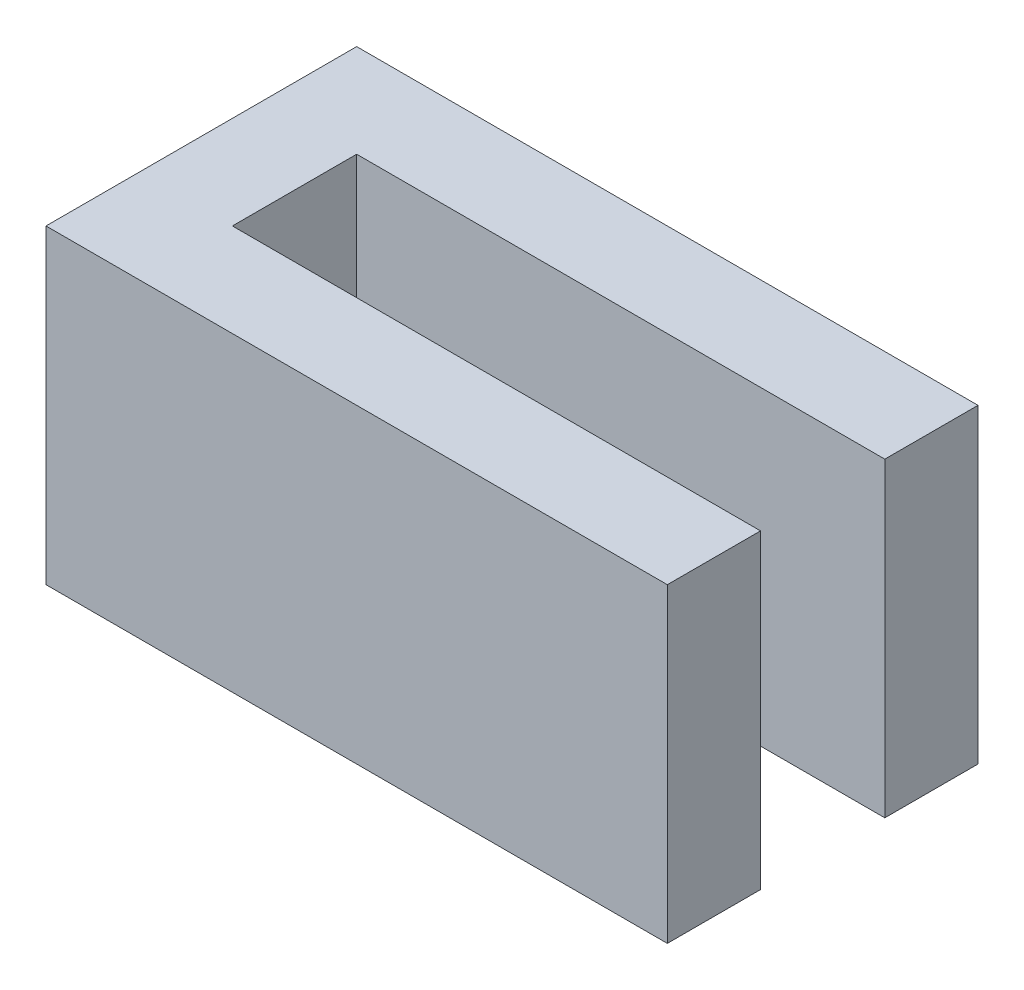
ISO-10303-21;
HEADER;
FILE_DESCRIPTION(('STEP AP214'),'2;1');
FILE_NAME('part.step','',(''),(''),'','','');
FILE_SCHEMA(('AUTOMOTIVE_DESIGN { 1 0 10303 214 1 1 1 1 }'));
ENDSEC;
DATA;
#1=APPLICATION_CONTEXT('core data for automotive mechanical design processes');
#2=APPLICATION_PROTOCOL_DEFINITION('international standard','automotive_design',2000,#1);
#3=PRODUCT_CONTEXT('',#1,'mechanical');
#4=PRODUCT('Part','Part','',(#3));
#5=PRODUCT_RELATED_PRODUCT_CATEGORY('part','',(#4));
#6=PRODUCT_DEFINITION_FORMATION('','',#4);
#7=PRODUCT_DEFINITION_CONTEXT('part definition',#1,'design');
#8=PRODUCT_DEFINITION('design','',#6,#7);
#9=PRODUCT_DEFINITION_SHAPE('','',#8);
#10=(LENGTH_UNIT() NAMED_UNIT(*) SI_UNIT(.MILLI.,.METRE.));
#11=(NAMED_UNIT(*) PLANE_ANGLE_UNIT() SI_UNIT($,.RADIAN.));
#12=(NAMED_UNIT(*) SI_UNIT($,.STERADIAN.) SOLID_ANGLE_UNIT());
#13=UNCERTAINTY_MEASURE_WITH_UNIT(LENGTH_MEASURE(1.E-05),#10,'distance_accuracy_value','');
#14=(GEOMETRIC_REPRESENTATION_CONTEXT(3) GLOBAL_UNCERTAINTY_ASSIGNED_CONTEXT((#13)) GLOBAL_UNIT_ASSIGNED_CONTEXT((#10,
#11,#12)) REPRESENTATION_CONTEXT('',''));
#15=CARTESIAN_POINT('',(0.,0.,0.));
#16=DIRECTION('',(0.,0.,1.));
#17=DIRECTION('',(1.,0.,0.));
#18=AXIS2_PLACEMENT_3D('',#15,#16,#17);
#19=CARTESIAN_POINT('',(0.,50.,-50.));
#20=DIRECTION('',(1.,0.,0.));
#21=DIRECTION('',(0.,0.,-1.));
#22=AXIS2_PLACEMENT_3D('',#19,#20,#21);
#23=PLANE('',#22);
#24=DIRECTION('',(0.,0.,1.));
#25=VECTOR('',#24,1.);
#26=CARTESIAN_POINT('',(0.,0.,-50.));
#27=LINE('',#26,#25);
#28=CARTESIAN_POINT('',(0.,0.,-50.));
#29=VERTEX_POINT('',#28);
#30=CARTESIAN_POINT('',(0.,0.,0.));
#31=VERTEX_POINT('',#30);
#32=EDGE_CURVE('E131',#29,#31,#27,.T.);
#33=ORIENTED_EDGE('',*,*,#32,.T.);
#34=DIRECTION('',(0.,-1.,0.));
#35=VECTOR('',#34,1.);
#36=CARTESIAN_POINT('',(0.,50.,0.));
#37=LINE('',#36,#35);
#38=CARTESIAN_POINT('',(0.,50.,0.));
#39=VERTEX_POINT('',#38);
#40=EDGE_CURVE('E11',#39,#31,#37,.T.);
#41=ORIENTED_EDGE('',*,*,#40,.F.);
#42=DIRECTION('',(0.,0.,1.));
#43=VECTOR('',#42,1.);
#44=CARTESIAN_POINT('',(0.,50.,-50.));
#45=LINE('',#44,#43);
#46=CARTESIAN_POINT('',(0.,50.,-50.));
#47=VERTEX_POINT('',#46);
#48=EDGE_CURVE('E145',#47,#39,#45,.T.);
#49=ORIENTED_EDGE('',*,*,#48,.F.);
#50=DIRECTION('',(0.,-1.,0.));
#51=VECTOR('',#50,1.);
#52=CARTESIAN_POINT('',(0.,50.,-50.));
#53=LINE('',#52,#51);
#54=EDGE_CURVE('E127',#47,#29,#53,.T.);
#55=ORIENTED_EDGE('',*,*,#54,.T.);
#56=EDGE_LOOP('',(#33,#41,#49,#55));
#57=FACE_BOUND('',#56,.T.);
#58=ADVANCED_FACE('F35',(#57),#23,.F.);
#59=CARTESIAN_POINT('',(0.,50.,0.));
#60=DIRECTION('',(0.,0.,-1.));
#61=DIRECTION('',(-1.,0.,0.));
#62=AXIS2_PLACEMENT_3D('',#59,#60,#61);
#63=PLANE('',#62);
#64=DIRECTION('',(1.,0.,0.));
#65=VECTOR('',#64,1.);
#66=CARTESIAN_POINT('',(0.,0.,0.));
#67=LINE('',#66,#65);
#68=CARTESIAN_POINT('',(100.,0.,0.));
#69=VERTEX_POINT('',#68);
#70=EDGE_CURVE('E134',#31,#69,#67,.T.);
#71=ORIENTED_EDGE('',*,*,#70,.T.);
#72=DIRECTION('',(0.,-1.,0.));
#73=VECTOR('',#72,1.);
#74=CARTESIAN_POINT('',(100.,50.,0.));
#75=LINE('',#74,#73);
#76=CARTESIAN_POINT('',(100.,50.,0.));
#77=VERTEX_POINT('',#76);
#78=EDGE_CURVE('E43',#77,#69,#75,.T.);
#79=ORIENTED_EDGE('',*,*,#78,.F.);
#80=DIRECTION('',(1.,0.,0.));
#81=VECTOR('',#80,1.);
#82=CARTESIAN_POINT('',(0.,50.,0.));
#83=LINE('',#82,#81);
#84=EDGE_CURVE('E94',#39,#77,#83,.T.);
#85=ORIENTED_EDGE('',*,*,#84,.F.);
#86=ORIENTED_EDGE('',*,*,#40,.T.);
#87=EDGE_LOOP('',(#71,#79,#85,#86));
#88=FACE_BOUND('',#87,.T.);
#89=ADVANCED_FACE('F180',(#88),#63,.F.);
#90=CARTESIAN_POINT('',(100.,50.,0.));
#91=DIRECTION('',(-1.,0.,0.));
#92=DIRECTION('',(0.,0.,1.));
#93=AXIS2_PLACEMENT_3D('',#90,#91,#92);
#94=PLANE('',#93);
#95=DIRECTION('',(0.,0.,-1.));
#96=VECTOR('',#95,1.);
#97=CARTESIAN_POINT('',(100.,0.,0.));
#98=LINE('',#97,#96);
#99=CARTESIAN_POINT('',(100.,0.,-15.));
#100=VERTEX_POINT('',#99);
#101=EDGE_CURVE('E136',#69,#100,#98,.T.);
#102=ORIENTED_EDGE('',*,*,#101,.T.);
#103=DIRECTION('',(0.,-1.,0.));
#104=VECTOR('',#103,1.);
#105=CARTESIAN_POINT('',(100.,50.,-15.));
#106=LINE('',#105,#104);
#107=CARTESIAN_POINT('',(100.,50.,-15.));
#108=VERTEX_POINT('',#107);
#109=EDGE_CURVE('E152',#108,#100,#106,.T.);
#110=ORIENTED_EDGE('',*,*,#109,.F.);
#111=DIRECTION('',(0.,0.,-1.));
#112=VECTOR('',#111,1.);
#113=CARTESIAN_POINT('',(100.,50.,0.));
#114=LINE('',#113,#112);
#115=EDGE_CURVE('E160',#77,#108,#114,.T.);
#116=ORIENTED_EDGE('',*,*,#115,.F.);
#117=ORIENTED_EDGE('',*,*,#78,.T.);
#118=EDGE_LOOP('',(#102,#110,#116,#117));
#119=FACE_BOUND('',#118,.T.);
#120=ADVANCED_FACE('F158',(#119),#94,.F.);
#121=CARTESIAN_POINT('',(100.,50.,-15.));
#122=DIRECTION('',(0.,0.,1.));
#123=DIRECTION('',(1.,0.,0.));
#124=AXIS2_PLACEMENT_3D('',#121,#122,#123);
#125=PLANE('',#124);
#126=DIRECTION('',(-1.,0.,0.));
#127=VECTOR('',#126,1.);
#128=CARTESIAN_POINT('',(100.,0.,-15.));
#129=LINE('',#128,#127);
#130=CARTESIAN_POINT('',(15.,0.,-15.));
#131=VERTEX_POINT('',#130);
#132=EDGE_CURVE('E138',#100,#131,#129,.T.);
#133=ORIENTED_EDGE('',*,*,#132,.T.);
#134=DIRECTION('',(0.,-1.,0.));
#135=VECTOR('',#134,1.);
#136=CARTESIAN_POINT('',(15.,50.,-15.));
#137=LINE('',#136,#135);
#138=CARTESIAN_POINT('',(15.,50.,-15.));
#139=VERTEX_POINT('',#138);
#140=EDGE_CURVE('E149',#139,#131,#137,.T.);
#141=ORIENTED_EDGE('',*,*,#140,.F.);
#142=DIRECTION('',(-1.,0.,0.));
#143=VECTOR('',#142,1.);
#144=CARTESIAN_POINT('',(100.,50.,-15.));
#145=LINE('',#144,#143);
#146=EDGE_CURVE('E172',#108,#139,#145,.T.);
#147=ORIENTED_EDGE('',*,*,#146,.F.);
#148=ORIENTED_EDGE('',*,*,#109,.T.);
#149=EDGE_LOOP('',(#133,#141,#147,#148));
#150=FACE_BOUND('',#149,.T.);
#151=ADVANCED_FACE('F168',(#150),#125,.F.);
#152=CARTESIAN_POINT('',(15.,50.,-15.));
#153=DIRECTION('',(-1.,0.,0.));
#154=DIRECTION('',(0.,0.,1.));
#155=AXIS2_PLACEMENT_3D('',#152,#153,#154);
#156=PLANE('',#155);
#157=DIRECTION('',(0.,0.,-1.));
#158=VECTOR('',#157,1.);
#159=CARTESIAN_POINT('',(15.,0.,-15.));
#160=LINE('',#159,#158);
#161=CARTESIAN_POINT('',(15.,0.,-35.));
#162=VERTEX_POINT('',#161);
#163=EDGE_CURVE('E140',#131,#162,#160,.T.);
#164=ORIENTED_EDGE('',*,*,#163,.T.);
#165=DIRECTION('',(0.,-1.,0.));
#166=VECTOR('',#165,1.);
#167=CARTESIAN_POINT('',(15.,50.,-35.));
#168=LINE('',#167,#166);
#169=CARTESIAN_POINT('',(15.,50.,-35.));
#170=VERTEX_POINT('',#169);
#171=EDGE_CURVE('E122',#170,#162,#168,.T.);
#172=ORIENTED_EDGE('',*,*,#171,.F.);
#173=DIRECTION('',(0.,0.,-1.));
#174=VECTOR('',#173,1.);
#175=CARTESIAN_POINT('',(15.,50.,-15.));
#176=LINE('',#175,#174);
#177=EDGE_CURVE('E113',#139,#170,#176,.T.);
#178=ORIENTED_EDGE('',*,*,#177,.F.);
#179=ORIENTED_EDGE('',*,*,#140,.T.);
#180=EDGE_LOOP('',(#164,#172,#178,#179));
#181=FACE_BOUND('',#180,.T.);
#182=ADVANCED_FACE('F171',(#181),#156,.F.);
#183=CARTESIAN_POINT('',(15.,50.,-35.));
#184=DIRECTION('',(0.,0.,-1.));
#185=DIRECTION('',(-1.,0.,0.));
#186=AXIS2_PLACEMENT_3D('',#183,#184,#185);
#187=PLANE('',#186);
#188=DIRECTION('',(1.,0.,0.));
#189=VECTOR('',#188,1.);
#190=CARTESIAN_POINT('',(15.,0.,-35.));
#191=LINE('',#190,#189);
#192=CARTESIAN_POINT('',(100.,0.,-35.));
#193=VERTEX_POINT('',#192);
#194=EDGE_CURVE('E121',#162,#193,#191,.T.);
#195=ORIENTED_EDGE('',*,*,#194,.T.);
#196=DIRECTION('',(0.,-1.,0.));
#197=VECTOR('',#196,1.);
#198=CARTESIAN_POINT('',(100.,50.,-35.));
#199=LINE('',#198,#197);
#200=CARTESIAN_POINT('',(100.,50.,-35.));
#201=VERTEX_POINT('',#200);
#202=EDGE_CURVE('E118',#201,#193,#199,.T.);
#203=ORIENTED_EDGE('',*,*,#202,.F.);
#204=DIRECTION('',(1.,0.,0.));
#205=VECTOR('',#204,1.);
#206=CARTESIAN_POINT('',(15.,50.,-35.));
#207=LINE('',#206,#205);
#208=EDGE_CURVE('E107',#170,#201,#207,.T.);
#209=ORIENTED_EDGE('',*,*,#208,.F.);
#210=ORIENTED_EDGE('',*,*,#171,.T.);
#211=EDGE_LOOP('',(#195,#203,#209,#210));
#212=FACE_BOUND('',#211,.T.);
#213=ADVANCED_FACE('F119',(#212),#187,.F.);
#214=CARTESIAN_POINT('',(100.,50.,-35.));
#215=DIRECTION('',(-1.,0.,0.));
#216=DIRECTION('',(0.,0.,1.));
#217=AXIS2_PLACEMENT_3D('',#214,#215,#216);
#218=PLANE('',#217);
#219=DIRECTION('',(0.,0.,-1.));
#220=VECTOR('',#219,1.);
#221=CARTESIAN_POINT('',(100.,0.,-35.));
#222=LINE('',#221,#220);
#223=CARTESIAN_POINT('',(100.,0.,-50.));
#224=VERTEX_POINT('',#223);
#225=EDGE_CURVE('E80',#193,#224,#222,.T.);
#226=ORIENTED_EDGE('',*,*,#225,.T.);
#227=DIRECTION('',(0.,-1.,0.));
#228=VECTOR('',#227,1.);
#229=CARTESIAN_POINT('',(100.,50.,-50.));
#230=LINE('',#229,#228);
#231=CARTESIAN_POINT('',(100.,50.,-50.));
#232=VERTEX_POINT('',#231);
#233=EDGE_CURVE('E123',#232,#224,#230,.T.);
#234=ORIENTED_EDGE('',*,*,#233,.F.);
#235=DIRECTION('',(0.,0.,-1.));
#236=VECTOR('',#235,1.);
#237=CARTESIAN_POINT('',(100.,50.,-35.));
#238=LINE('',#237,#236);
#239=EDGE_CURVE('E111',#201,#232,#238,.T.);
#240=ORIENTED_EDGE('',*,*,#239,.F.);
#241=ORIENTED_EDGE('',*,*,#202,.T.);
#242=EDGE_LOOP('',(#226,#234,#240,#241));
#243=FACE_BOUND('',#242,.T.);
#244=ADVANCED_FACE('F125',(#243),#218,.F.);
#245=CARTESIAN_POINT('',(100.,50.,-50.));
#246=DIRECTION('',(0.,0.,1.));
#247=DIRECTION('',(1.,0.,0.));
#248=AXIS2_PLACEMENT_3D('',#245,#246,#247);
#249=PLANE('',#248);
#250=DIRECTION('',(-1.,0.,0.));
#251=VECTOR('',#250,1.);
#252=CARTESIAN_POINT('',(100.,0.,-50.));
#253=LINE('',#252,#251);
#254=EDGE_CURVE('E86',#224,#29,#253,.T.);
#255=ORIENTED_EDGE('',*,*,#254,.T.);
#256=ORIENTED_EDGE('',*,*,#54,.F.);
#257=DIRECTION('',(-1.,0.,0.));
#258=VECTOR('',#257,1.);
#259=CARTESIAN_POINT('',(100.,50.,-50.));
#260=LINE('',#259,#258);
#261=EDGE_CURVE('E51',#232,#47,#260,.T.);
#262=ORIENTED_EDGE('',*,*,#261,.F.);
#263=ORIENTED_EDGE('',*,*,#233,.T.);
#264=EDGE_LOOP('',(#255,#256,#262,#263));
#265=FACE_BOUND('',#264,.T.);
#266=ADVANCED_FACE('F196',(#265),#249,.F.);
#267=CARTESIAN_POINT('',(0.,50.,0.));
#268=DIRECTION('',(0.,1.,0.));
#269=DIRECTION('',(0.,0.,1.));
#270=AXIS2_PLACEMENT_3D('',#267,#268,#269);
#271=PLANE('',#270);
#272=ORIENTED_EDGE('',*,*,#48,.T.);
#273=ORIENTED_EDGE('',*,*,#84,.T.);
#274=ORIENTED_EDGE('',*,*,#115,.T.);
#275=ORIENTED_EDGE('',*,*,#146,.T.);
#276=ORIENTED_EDGE('',*,*,#177,.T.);
#277=ORIENTED_EDGE('',*,*,#208,.T.);
#278=ORIENTED_EDGE('',*,*,#239,.T.);
#279=ORIENTED_EDGE('',*,*,#261,.T.);
#280=EDGE_LOOP('',(#272,#273,#274,#275,#276,#277,#278,#279));
#281=FACE_BOUND('',#280,.T.);
#282=ADVANCED_FACE('F109',(#281),#271,.T.);
#283=CARTESIAN_POINT('',(0.,0.,0.));
#284=DIRECTION('',(0.,1.,0.));
#285=DIRECTION('',(0.,0.,1.));
#286=AXIS2_PLACEMENT_3D('',#283,#284,#285);
#287=PLANE('',#286);
#288=ORIENTED_EDGE('',*,*,#32,.F.);
#289=ORIENTED_EDGE('',*,*,#254,.F.);
#290=ORIENTED_EDGE('',*,*,#225,.F.);
#291=ORIENTED_EDGE('',*,*,#194,.F.);
#292=ORIENTED_EDGE('',*,*,#163,.F.);
#293=ORIENTED_EDGE('',*,*,#132,.F.);
#294=ORIENTED_EDGE('',*,*,#101,.F.);
#295=ORIENTED_EDGE('',*,*,#70,.F.);
#296=EDGE_LOOP('',(#288,#289,#290,#291,#292,#293,#294,#295));
#297=FACE_BOUND('',#296,.T.);
#298=ADVANCED_FACE('F164',(#297),#287,.F.);
#299=CLOSED_SHELL('',(#58,#89,#120,#151,#182,#213,#244,#266,#282,#298));
#300=MANIFOLD_SOLID_BREP('B2',#299);
#301=ADVANCED_BREP_SHAPE_REPRESENTATION('',(#18,#300),#14);
#302=SHAPE_DEFINITION_REPRESENTATION(#9,#301);
ENDSEC;
END-ISO-10303-21;
